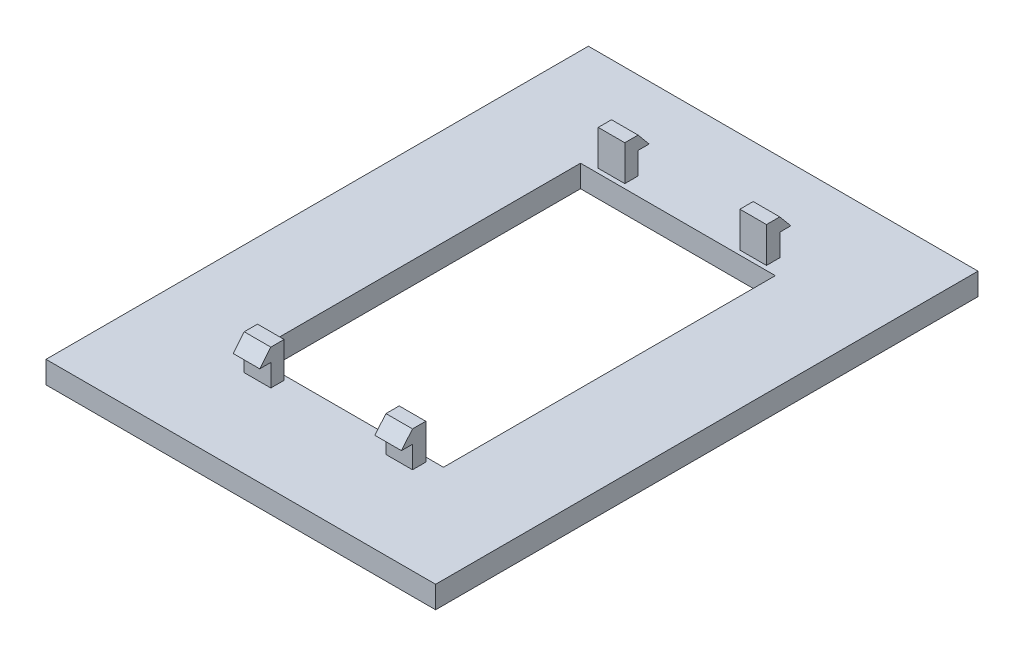
ISO-10303-21;
HEADER;
FILE_DESCRIPTION(('STEP AP214'),'2;1');
FILE_NAME('part.step','',(''),(''),'','','');
FILE_SCHEMA(('AUTOMOTIVE_DESIGN { 1 0 10303 214 1 1 1 1 }'));
ENDSEC;
DATA;
#1=APPLICATION_CONTEXT('core data for automotive mechanical design processes');
#2=APPLICATION_PROTOCOL_DEFINITION('international standard','automotive_design',2000,#1);
#3=PRODUCT_CONTEXT('',#1,'mechanical');
#4=PRODUCT('Part','Part','',(#3));
#5=PRODUCT_RELATED_PRODUCT_CATEGORY('part','',(#4));
#6=PRODUCT_DEFINITION_FORMATION('','',#4);
#7=PRODUCT_DEFINITION_CONTEXT('part definition',#1,'design');
#8=PRODUCT_DEFINITION('design','',#6,#7);
#9=PRODUCT_DEFINITION_SHAPE('','',#8);
#10=(LENGTH_UNIT() NAMED_UNIT(*) SI_UNIT(.MILLI.,.METRE.));
#11=(NAMED_UNIT(*) PLANE_ANGLE_UNIT() SI_UNIT($,.RADIAN.));
#12=(NAMED_UNIT(*) SI_UNIT($,.STERADIAN.) SOLID_ANGLE_UNIT());
#13=UNCERTAINTY_MEASURE_WITH_UNIT(LENGTH_MEASURE(1.E-05),#10,'distance_accuracy_value','');
#14=(GEOMETRIC_REPRESENTATION_CONTEXT(3) GLOBAL_UNCERTAINTY_ASSIGNED_CONTEXT((#13)) GLOBAL_UNIT_ASSIGNED_CONTEXT((#10,
#11,#12)) REPRESENTATION_CONTEXT('',''));
#15=CARTESIAN_POINT('',(0.,0.,0.));
#16=DIRECTION('',(0.,0.,1.));
#17=DIRECTION('',(1.,0.,0.));
#18=AXIS2_PLACEMENT_3D('',#15,#16,#17);
#19=CARTESIAN_POINT('',(19.,10.,0.));
#20=DIRECTION('',(0.,1.,0.));
#21=DIRECTION('',(0.,0.,1.));
#22=AXIS2_PLACEMENT_3D('',#19,#20,#21);
#23=PLANE('',#22);
#24=DIRECTION('',(0.,0.,-1.));
#25=VECTOR('',#24,1.);
#26=CARTESIAN_POINT('',(-13.,10.,0.));
#27=LINE('',#26,#25);
#28=CARTESIAN_POINT('',(-13.,10.,-41.475));
#29=VERTEX_POINT('',#28);
#30=CARTESIAN_POINT('',(-13.,10.,-43.975));
#31=VERTEX_POINT('',#30);
#32=EDGE_CURVE('E49',#29,#31,#27,.T.);
#33=ORIENTED_EDGE('',*,*,#32,.F.);
#34=DIRECTION('',(-1.,0.,0.));
#35=VECTOR('',#34,1.);
#36=CARTESIAN_POINT('',(19.,10.,-41.475));
#37=LINE('',#36,#35);
#38=CARTESIAN_POINT('',(-19.,10.,-41.475));
#39=VERTEX_POINT('',#38);
#40=EDGE_CURVE('E265',#29,#39,#37,.T.);
#41=ORIENTED_EDGE('',*,*,#40,.T.);
#42=DIRECTION('',(0.,0.,-1.));
#43=VECTOR('',#42,1.);
#44=CARTESIAN_POINT('',(-19.,10.,0.));
#45=LINE('',#44,#43);
#46=CARTESIAN_POINT('',(-19.,10.,-43.975));
#47=VERTEX_POINT('',#46);
#48=EDGE_CURVE('E481',#39,#47,#45,.T.);
#49=ORIENTED_EDGE('',*,*,#48,.T.);
#50=DIRECTION('',(-1.,0.,0.));
#51=VECTOR('',#50,1.);
#52=CARTESIAN_POINT('',(19.,10.,-43.975));
#53=LINE('',#52,#51);
#54=EDGE_CURVE('E266',#31,#47,#53,.T.);
#55=ORIENTED_EDGE('',*,*,#54,.F.);
#56=EDGE_LOOP('',(#33,#41,#49,#55));
#57=FACE_BOUND('',#56,.T.);
#58=ADVANCED_FACE('F34',(#57),#23,.F.);
#59=DIRECTION('',(0.,0.,1.));
#60=VECTOR('',#59,1.);
#61=CARTESIAN_POINT('',(13.,10.,0.));
#62=LINE('',#61,#60);
#63=CARTESIAN_POINT('',(13.,10.,-43.975));
#64=VERTEX_POINT('',#63);
#65=CARTESIAN_POINT('',(13.,10.,-41.475));
#66=VERTEX_POINT('',#65);
#67=EDGE_CURVE('E244',#64,#66,#62,.T.);
#68=ORIENTED_EDGE('',*,*,#67,.F.);
#69=CARTESIAN_POINT('',(19.,10.,-43.975));
#70=VERTEX_POINT('',#69);
#71=EDGE_CURVE('E256',#70,#64,#53,.T.);
#72=ORIENTED_EDGE('',*,*,#71,.F.);
#73=DIRECTION('',(0.,0.,-1.));
#74=VECTOR('',#73,1.);
#75=CARTESIAN_POINT('',(19.,10.,0.));
#76=LINE('',#75,#74);
#77=CARTESIAN_POINT('',(19.,10.,-41.475));
#78=VERTEX_POINT('',#77);
#79=EDGE_CURVE('E270',#78,#70,#76,.T.);
#80=ORIENTED_EDGE('',*,*,#79,.F.);
#81=EDGE_CURVE('E259',#78,#66,#37,.T.);
#82=ORIENTED_EDGE('',*,*,#81,.T.);
#83=EDGE_LOOP('',(#68,#72,#80,#82));
#84=FACE_BOUND('',#83,.T.);
#85=ADVANCED_FACE('F255',(#84),#23,.F.);
#86=CARTESIAN_POINT('',(19.,25.7254098360656,-30.8704918032787));
#87=DIRECTION('',(0.,-0.64018439966448,0.768221279597376));
#88=DIRECTION('',(0.,-0.768221279597376,-0.64018439966448));
#89=AXIS2_PLACEMENT_3D('',#86,#87,#88);
#90=PLANE('',#89);
#91=DIRECTION('',(0.,0.768221279597376,0.64018439966448));
#92=VECTOR('',#91,1.);
#93=CARTESIAN_POINT('',(-13.,25.7254098360656,-30.8704918032787));
#94=LINE('',#93,#92);
#95=CARTESIAN_POINT('',(-13.,13.,-41.475));
#96=VERTEX_POINT('',#95);
#97=EDGE_CURVE('E497',#31,#96,#94,.T.);
#98=ORIENTED_EDGE('',*,*,#97,.F.);
#99=ORIENTED_EDGE('',*,*,#54,.T.);
#100=DIRECTION('',(0.,0.768221279597376,0.64018439966448));
#101=VECTOR('',#100,1.);
#102=CARTESIAN_POINT('',(-19.,25.7254098360656,-30.8704918032787));
#103=LINE('',#102,#101);
#104=CARTESIAN_POINT('',(-19.,13.,-41.475));
#105=VERTEX_POINT('',#104);
#106=EDGE_CURVE('E483',#47,#105,#103,.T.);
#107=ORIENTED_EDGE('',*,*,#106,.T.);
#108=DIRECTION('',(1.,0.,0.));
#109=VECTOR('',#108,1.);
#110=CARTESIAN_POINT('',(0.,13.,-41.475));
#111=LINE('',#110,#109);
#112=EDGE_CURVE('E372',#105,#96,#111,.T.);
#113=ORIENTED_EDGE('',*,*,#112,.T.);
#114=EDGE_LOOP('',(#98,#99,#107,#113));
#115=FACE_BOUND('',#114,.T.);
#116=ADVANCED_FACE('F496',(#115),#90,.F.);
#117=DIRECTION('',(0.,-0.768221279597376,-0.64018439966448));
#118=VECTOR('',#117,1.);
#119=CARTESIAN_POINT('',(13.,25.7254098360656,-30.8704918032787));
#120=LINE('',#119,#118);
#121=CARTESIAN_POINT('',(13.,13.,-41.475));
#122=VERTEX_POINT('',#121);
#123=EDGE_CURVE('E241',#122,#64,#120,.T.);
#124=ORIENTED_EDGE('',*,*,#123,.F.);
#125=DIRECTION('',(-1.,0.,0.));
#126=VECTOR('',#125,1.);
#127=CARTESIAN_POINT('',(0.,13.,-41.475));
#128=LINE('',#127,#126);
#129=CARTESIAN_POINT('',(19.,13.,-41.475));
#130=VERTEX_POINT('',#129);
#131=EDGE_CURVE('E337',#130,#122,#128,.T.);
#132=ORIENTED_EDGE('',*,*,#131,.F.);
#133=DIRECTION('',(0.,0.768221279597376,0.64018439966448));
#134=VECTOR('',#133,1.);
#135=CARTESIAN_POINT('',(19.,25.7254098360656,-30.8704918032787));
#136=LINE('',#135,#134);
#137=EDGE_CURVE('E264',#70,#130,#136,.T.);
#138=ORIENTED_EDGE('',*,*,#137,.F.);
#139=ORIENTED_EDGE('',*,*,#71,.T.);
#140=EDGE_LOOP('',(#124,#132,#138,#139));
#141=FACE_BOUND('',#140,.T.);
#142=ADVANCED_FACE('F263',(#141),#90,.F.);
#143=CARTESIAN_POINT('',(19.,10.,0.));
#144=DIRECTION('',(0.,-1.,0.));
#145=DIRECTION('',(0.,0.,-1.));
#146=AXIS2_PLACEMENT_3D('',#143,#144,#145);
#147=PLANE('',#146);
#148=DIRECTION('',(-1.,0.,0.));
#149=VECTOR('',#148,1.);
#150=CARTESIAN_POINT('',(19.,10.,41.475));
#151=LINE('',#150,#149);
#152=CARTESIAN_POINT('',(-13.,10.,41.475));
#153=VERTEX_POINT('',#152);
#154=CARTESIAN_POINT('',(-19.,10.,41.475));
#155=VERTEX_POINT('',#154);
#156=EDGE_CURVE('E471',#153,#155,#151,.T.);
#157=ORIENTED_EDGE('',*,*,#156,.F.);
#158=DIRECTION('',(0.,0.,1.));
#159=VECTOR('',#158,1.);
#160=CARTESIAN_POINT('',(-13.,10.,0.));
#161=LINE('',#160,#159);
#162=CARTESIAN_POINT('',(-13.,10.,43.975));
#163=VERTEX_POINT('',#162);
#164=EDGE_CURVE('E261',#153,#163,#161,.T.);
#165=ORIENTED_EDGE('',*,*,#164,.T.);
#166=DIRECTION('',(-1.,0.,0.));
#167=VECTOR('',#166,1.);
#168=CARTESIAN_POINT('',(19.,10.,43.975));
#169=LINE('',#168,#167);
#170=CARTESIAN_POINT('',(-19.,10.,43.975));
#171=VERTEX_POINT('',#170);
#172=EDGE_CURVE('E472',#163,#171,#169,.T.);
#173=ORIENTED_EDGE('',*,*,#172,.T.);
#174=DIRECTION('',(0.,0.,1.));
#175=VECTOR('',#174,1.);
#176=CARTESIAN_POINT('',(-19.,10.,0.));
#177=LINE('',#176,#175);
#178=EDGE_CURVE('E500',#155,#171,#177,.T.);
#179=ORIENTED_EDGE('',*,*,#178,.F.);
#180=EDGE_LOOP('',(#157,#165,#173,#179));
#181=FACE_BOUND('',#180,.T.);
#182=ADVANCED_FACE('F536',(#181),#147,.T.);
#183=CARTESIAN_POINT('',(19.,10.,43.975));
#184=VERTEX_POINT('',#183);
#185=CARTESIAN_POINT('',(13.,10.,43.975));
#186=VERTEX_POINT('',#185);
#187=EDGE_CURVE('E461',#184,#186,#169,.T.);
#188=ORIENTED_EDGE('',*,*,#187,.T.);
#189=DIRECTION('',(0.,0.,-1.));
#190=VECTOR('',#189,1.);
#191=CARTESIAN_POINT('',(13.,10.,0.));
#192=LINE('',#191,#190);
#193=CARTESIAN_POINT('',(13.,10.,41.475));
#194=VERTEX_POINT('',#193);
#195=EDGE_CURVE('E57',#186,#194,#192,.T.);
#196=ORIENTED_EDGE('',*,*,#195,.T.);
#197=CARTESIAN_POINT('',(19.,10.,41.475));
#198=VERTEX_POINT('',#197);
#199=EDGE_CURVE('E475',#198,#194,#151,.T.);
#200=ORIENTED_EDGE('',*,*,#199,.F.);
#201=DIRECTION('',(0.,0.,1.));
#202=VECTOR('',#201,1.);
#203=CARTESIAN_POINT('',(19.,10.,0.));
#204=LINE('',#203,#202);
#205=EDGE_CURVE('E470',#198,#184,#204,.T.);
#206=ORIENTED_EDGE('',*,*,#205,.T.);
#207=EDGE_LOOP('',(#188,#196,#200,#206));
#208=FACE_BOUND('',#207,.T.);
#209=ADVANCED_FACE('F466',(#208),#147,.T.);
#210=CARTESIAN_POINT('',(19.,25.7254098360656,30.8704918032787));
#211=DIRECTION('',(0.,0.64018439966448,0.768221279597376));
#212=DIRECTION('',(0.,-0.768221279597376,0.64018439966448));
#213=AXIS2_PLACEMENT_3D('',#210,#211,#212);
#214=PLANE('',#213);
#215=ORIENTED_EDGE('',*,*,#172,.F.);
#216=DIRECTION('',(0.,0.768221279597376,-0.64018439966448));
#217=VECTOR('',#216,1.);
#218=CARTESIAN_POINT('',(-13.,25.7254098360656,30.8704918032787));
#219=LINE('',#218,#217);
#220=CARTESIAN_POINT('',(-13.,13.,41.475));
#221=VERTEX_POINT('',#220);
#222=EDGE_CURVE('E11',#163,#221,#219,.T.);
#223=ORIENTED_EDGE('',*,*,#222,.T.);
#224=DIRECTION('',(1.,0.,0.));
#225=VECTOR('',#224,1.);
#226=CARTESIAN_POINT('',(1.91860416443035E-13,13.,41.4749999999999));
#227=LINE('',#226,#225);
#228=CARTESIAN_POINT('',(-19.,13.,41.475));
#229=VERTEX_POINT('',#228);
#230=EDGE_CURVE('E313',#229,#221,#227,.T.);
#231=ORIENTED_EDGE('',*,*,#230,.F.);
#232=DIRECTION('',(0.,0.768221279597376,-0.64018439966448));
#233=VECTOR('',#232,1.);
#234=CARTESIAN_POINT('',(-19.,25.7254098360656,30.8704918032787));
#235=LINE('',#234,#233);
#236=EDGE_CURVE('E506',#171,#229,#235,.T.);
#237=ORIENTED_EDGE('',*,*,#236,.F.);
#238=EDGE_LOOP('',(#215,#223,#231,#237));
#239=FACE_BOUND('',#238,.T.);
#240=ADVANCED_FACE('F537',(#239),#214,.T.);
#241=DIRECTION('',(-1.,0.,0.));
#242=VECTOR('',#241,1.);
#243=CARTESIAN_POINT('',(0.,13.,41.475));
#244=LINE('',#243,#242);
#245=CARTESIAN_POINT('',(19.,13.,41.475));
#246=VERTEX_POINT('',#245);
#247=CARTESIAN_POINT('',(13.,13.,41.475));
#248=VERTEX_POINT('',#247);
#249=EDGE_CURVE('E280',#246,#248,#244,.T.);
#250=ORIENTED_EDGE('',*,*,#249,.T.);
#251=DIRECTION('',(0.,-0.768221279597376,0.64018439966448));
#252=VECTOR('',#251,1.);
#253=CARTESIAN_POINT('',(13.,25.7254098360656,30.8704918032787));
#254=LINE('',#253,#252);
#255=EDGE_CURVE('E42',#248,#186,#254,.T.);
#256=ORIENTED_EDGE('',*,*,#255,.T.);
#257=ORIENTED_EDGE('',*,*,#187,.F.);
#258=DIRECTION('',(0.,0.768221279597376,-0.64018439966448));
#259=VECTOR('',#258,1.);
#260=CARTESIAN_POINT('',(19.,25.7254098360656,30.8704918032787));
#261=LINE('',#260,#259);
#262=EDGE_CURVE('E477',#184,#246,#261,.T.);
#263=ORIENTED_EDGE('',*,*,#262,.T.);
#264=EDGE_LOOP('',(#250,#256,#257,#263));
#265=FACE_BOUND('',#264,.T.);
#266=ADVANCED_FACE('F459',(#265),#214,.T.);
#267=CARTESIAN_POINT('',(0.,13.,-41.475));
#268=DIRECTION('',(0.,0.,-1.));
#269=DIRECTION('',(-1.,0.,0.));
#270=AXIS2_PLACEMENT_3D('',#267,#268,#269);
#271=PLANE('',#270);
#272=DIRECTION('',(0.,-1.,0.));
#273=VECTOR('',#272,1.);
#274=CARTESIAN_POINT('',(-19.,13.,-41.475));
#275=LINE('',#274,#273);
#276=CARTESIAN_POINT('',(-19.,5.,-41.475));
#277=VERTEX_POINT('',#276);
#278=EDGE_CURVE('E389',#39,#277,#275,.T.);
#279=ORIENTED_EDGE('',*,*,#278,.F.);
#280=ORIENTED_EDGE('',*,*,#40,.F.);
#281=DIRECTION('',(0.,-1.,0.));
#282=VECTOR('',#281,1.);
#283=CARTESIAN_POINT('',(-13.,13.,-41.475));
#284=LINE('',#283,#282);
#285=CARTESIAN_POINT('',(-13.,5.,-41.475));
#286=VERTEX_POINT('',#285);
#287=EDGE_CURVE('E391',#29,#286,#284,.T.);
#288=ORIENTED_EDGE('',*,*,#287,.T.);
#289=DIRECTION('',(1.,0.,0.));
#290=VECTOR('',#289,1.);
#291=CARTESIAN_POINT('',(0.,5.,-41.475));
#292=LINE('',#291,#290);
#293=EDGE_CURVE('E382',#277,#286,#292,.T.);
#294=ORIENTED_EDGE('',*,*,#293,.F.);
#295=EDGE_LOOP('',(#279,#280,#288,#294));
#296=FACE_BOUND('',#295,.T.);
#297=ADVANCED_FACE('F639',(#296),#271,.T.);
#298=CARTESIAN_POINT('',(0.,13.,-41.475));
#299=DIRECTION('',(0.,0.,1.));
#300=DIRECTION('',(1.,0.,0.));
#301=AXIS2_PLACEMENT_3D('',#298,#299,#300);
#302=PLANE('',#301);
#303=ORIENTED_EDGE('',*,*,#81,.F.);
#304=DIRECTION('',(0.,-1.,0.));
#305=VECTOR('',#304,1.);
#306=CARTESIAN_POINT('',(19.,13.,-41.475));
#307=LINE('',#306,#305);
#308=CARTESIAN_POINT('',(19.,5.,-41.475));
#309=VERTEX_POINT('',#308);
#310=EDGE_CURVE('E346',#78,#309,#307,.T.);
#311=ORIENTED_EDGE('',*,*,#310,.T.);
#312=DIRECTION('',(-1.,0.,0.));
#313=VECTOR('',#312,1.);
#314=CARTESIAN_POINT('',(0.,5.,-41.475));
#315=LINE('',#314,#313);
#316=CARTESIAN_POINT('',(13.,5.,-41.475));
#317=VERTEX_POINT('',#316);
#318=EDGE_CURVE('E336',#309,#317,#315,.T.);
#319=ORIENTED_EDGE('',*,*,#318,.T.);
#320=DIRECTION('',(0.,-1.,0.));
#321=VECTOR('',#320,1.);
#322=CARTESIAN_POINT('',(13.,13.,-41.475));
#323=LINE('',#322,#321);
#324=EDGE_CURVE('E362',#66,#317,#323,.T.);
#325=ORIENTED_EDGE('',*,*,#324,.F.);
#326=EDGE_LOOP('',(#303,#311,#319,#325));
#327=FACE_BOUND('',#326,.T.);
#328=ADVANCED_FACE('F587',(#327),#302,.F.);
#329=CARTESIAN_POINT('',(0.,5.,0.));
#330=DIRECTION('',(0.,1.,0.));
#331=DIRECTION('',(0.,0.,1.));
#332=AXIS2_PLACEMENT_3D('',#329,#330,#331);
#333=PLANE('',#332);
#334=DIRECTION('',(0.,0.,-1.));
#335=VECTOR('',#334,1.);
#336=CARTESIAN_POINT('',(-13.,5.,0.));
#337=LINE('',#336,#335);
#338=CARTESIAN_POINT('',(-13.,5.,41.475));
#339=VERTEX_POINT('',#338);
#340=CARTESIAN_POINT('',(-13.,5.,38.475));
#341=VERTEX_POINT('',#340);
#342=EDGE_CURVE('E310',#339,#341,#337,.T.);
#343=ORIENTED_EDGE('',*,*,#342,.F.);
#344=DIRECTION('',(1.,0.,0.));
#345=VECTOR('',#344,1.);
#346=CARTESIAN_POINT('',(1.91860416443035E-13,5.,41.4749999999999));
#347=LINE('',#346,#345);
#348=CARTESIAN_POINT('',(-19.,5.,41.475));
#349=VERTEX_POINT('',#348);
#350=EDGE_CURVE('E324',#349,#339,#347,.T.);
#351=ORIENTED_EDGE('',*,*,#350,.F.);
#352=DIRECTION('',(0.,0.,1.));
#353=VECTOR('',#352,1.);
#354=CARTESIAN_POINT('',(-19.,5.,0.));
#355=LINE('',#354,#353);
#356=CARTESIAN_POINT('',(-19.,5.,38.475));
#357=VERTEX_POINT('',#356);
#358=EDGE_CURVE('E321',#357,#349,#355,.T.);
#359=ORIENTED_EDGE('',*,*,#358,.F.);
#360=DIRECTION('',(-1.,0.,0.));
#361=VECTOR('',#360,1.);
#362=CARTESIAN_POINT('',(0.,5.,38.475));
#363=LINE('',#362,#361);
#364=EDGE_CURVE('E305',#341,#357,#363,.T.);
#365=ORIENTED_EDGE('',*,*,#364,.F.);
#366=EDGE_LOOP('',(#343,#351,#359,#365));
#367=FACE_BOUND('',#366,.T.);
#368=DIRECTION('',(0.,0.,-1.));
#369=VECTOR('',#368,1.);
#370=CARTESIAN_POINT('',(22.,5.,-37.475));
#371=LINE('',#370,#369);
#372=CARTESIAN_POINT('',(22.,5.,37.475));
#373=VERTEX_POINT('',#372);
#374=CARTESIAN_POINT('',(22.,5.,-37.475));
#375=VERTEX_POINT('',#374);
#376=EDGE_CURVE('E396',#373,#375,#371,.T.);
#377=ORIENTED_EDGE('',*,*,#376,.F.);
#378=DIRECTION('',(1.,0.,0.));
#379=VECTOR('',#378,1.);
#380=CARTESIAN_POINT('',(-22.,5.,37.475));
#381=LINE('',#380,#379);
#382=CARTESIAN_POINT('',(-22.,5.,37.475));
#383=VERTEX_POINT('',#382);
#384=EDGE_CURVE('E401',#383,#373,#381,.T.);
#385=ORIENTED_EDGE('',*,*,#384,.F.);
#386=DIRECTION('',(0.,0.,1.));
#387=VECTOR('',#386,1.);
#388=CARTESIAN_POINT('',(-22.,5.,-37.475));
#389=LINE('',#388,#387);
#390=CARTESIAN_POINT('',(-22.,5.,-37.475));
#391=VERTEX_POINT('',#390);
#392=EDGE_CURVE('E414',#391,#383,#389,.T.);
#393=ORIENTED_EDGE('',*,*,#392,.F.);
#394=DIRECTION('',(-1.,0.,0.));
#395=VECTOR('',#394,1.);
#396=CARTESIAN_POINT('',(-22.,5.,-37.475));
#397=LINE('',#396,#395);
#398=EDGE_CURVE('E412',#375,#391,#397,.T.);
#399=ORIENTED_EDGE('',*,*,#398,.F.);
#400=EDGE_LOOP('',(#377,#385,#393,#399));
#401=FACE_BOUND('',#400,.T.);
#402=DIRECTION('',(0.,0.,1.));
#403=VECTOR('',#402,1.);
#404=CARTESIAN_POINT('',(-13.,5.,0.));
#405=LINE('',#404,#403);
#406=CARTESIAN_POINT('',(-13.,5.,-38.475));
#407=VERTEX_POINT('',#406);
#408=EDGE_CURVE('E380',#286,#407,#405,.T.);
#409=ORIENTED_EDGE('',*,*,#408,.T.);
#410=DIRECTION('',(-1.,0.,0.));
#411=VECTOR('',#410,1.);
#412=CARTESIAN_POINT('',(0.,5.,-38.475));
#413=LINE('',#412,#411);
#414=CARTESIAN_POINT('',(-19.,5.,-38.475));
#415=VERTEX_POINT('',#414);
#416=EDGE_CURVE('E364',#407,#415,#413,.T.);
#417=ORIENTED_EDGE('',*,*,#416,.T.);
#418=DIRECTION('',(0.,0.,-1.));
#419=VECTOR('',#418,1.);
#420=CARTESIAN_POINT('',(-19.,5.,0.));
#421=LINE('',#420,#419);
#422=EDGE_CURVE('E369',#415,#277,#421,.T.);
#423=ORIENTED_EDGE('',*,*,#422,.T.);
#424=ORIENTED_EDGE('',*,*,#293,.T.);
#425=EDGE_LOOP('',(#409,#417,#423,#424));
#426=FACE_BOUND('',#425,.T.);
#427=DIRECTION('',(0.,0.,1.));
#428=VECTOR('',#427,1.);
#429=CARTESIAN_POINT('',(13.,5.,0.));
#430=LINE('',#429,#428);
#431=CARTESIAN_POINT('',(13.,5.,-38.475));
#432=VERTEX_POINT('',#431);
#433=EDGE_CURVE('E349',#317,#432,#430,.T.);
#434=ORIENTED_EDGE('',*,*,#433,.F.);
#435=ORIENTED_EDGE('',*,*,#318,.F.);
#436=DIRECTION('',(0.,0.,-1.));
#437=VECTOR('',#436,1.);
#438=CARTESIAN_POINT('',(19.,5.,0.));
#439=LINE('',#438,#437);
#440=CARTESIAN_POINT('',(19.,5.,-38.475));
#441=VERTEX_POINT('',#440);
#442=EDGE_CURVE('E339',#441,#309,#439,.T.);
#443=ORIENTED_EDGE('',*,*,#442,.F.);
#444=DIRECTION('',(1.,0.,0.));
#445=VECTOR('',#444,1.);
#446=CARTESIAN_POINT('',(0.,5.,-38.475));
#447=LINE('',#446,#445);
#448=EDGE_CURVE('E351',#432,#441,#447,.T.);
#449=ORIENTED_EDGE('',*,*,#448,.F.);
#450=EDGE_LOOP('',(#434,#435,#443,#449));
#451=FACE_BOUND('',#450,.T.);
#452=DIRECTION('',(0.,0.,-1.));
#453=VECTOR('',#452,1.);
#454=CARTESIAN_POINT('',(13.,5.,0.));
#455=LINE('',#454,#453);
#456=CARTESIAN_POINT('',(13.,5.,41.475));
#457=VERTEX_POINT('',#456);
#458=CARTESIAN_POINT('',(13.,5.,38.475));
#459=VERTEX_POINT('',#458);
#460=EDGE_CURVE('E289',#457,#459,#455,.T.);
#461=ORIENTED_EDGE('',*,*,#460,.T.);
#462=DIRECTION('',(1.,0.,0.));
#463=VECTOR('',#462,1.);
#464=CARTESIAN_POINT('',(0.,5.,38.475));
#465=LINE('',#464,#463);
#466=CARTESIAN_POINT('',(19.,5.,38.475));
#467=VERTEX_POINT('',#466);
#468=EDGE_CURVE('E287',#459,#467,#465,.T.);
#469=ORIENTED_EDGE('',*,*,#468,.T.);
#470=DIRECTION('',(0.,0.,1.));
#471=VECTOR('',#470,1.);
#472=CARTESIAN_POINT('',(19.,5.,0.));
#473=LINE('',#472,#471);
#474=CARTESIAN_POINT('',(19.,5.,41.475));
#475=VERTEX_POINT('',#474);
#476=EDGE_CURVE('E277',#467,#475,#473,.T.);
#477=ORIENTED_EDGE('',*,*,#476,.T.);
#478=DIRECTION('',(-1.,0.,0.));
#479=VECTOR('',#478,1.);
#480=CARTESIAN_POINT('',(0.,5.,41.475));
#481=LINE('',#480,#479);
#482=EDGE_CURVE('E291',#475,#457,#481,.T.);
#483=ORIENTED_EDGE('',*,*,#482,.T.);
#484=EDGE_LOOP('',(#461,#469,#477,#483));
#485=FACE_BOUND('',#484,.T.);
#486=DIRECTION('',(0.,0.,-1.));
#487=VECTOR('',#486,1.);
#488=CARTESIAN_POINT('',(44.,5.,-61.25));
#489=LINE('',#488,#487);
#490=CARTESIAN_POINT('',(44.,5.,61.25));
#491=VERTEX_POINT('',#490);
#492=CARTESIAN_POINT('',(44.,5.,-61.25));
#493=VERTEX_POINT('',#492);
#494=EDGE_CURVE('E429',#491,#493,#489,.T.);
#495=ORIENTED_EDGE('',*,*,#494,.T.);
#496=DIRECTION('',(-1.,0.,0.));
#497=VECTOR('',#496,1.);
#498=CARTESIAN_POINT('',(-44.,5.,-61.25));
#499=LINE('',#498,#497);
#500=CARTESIAN_POINT('',(-44.,5.,-61.25));
#501=VERTEX_POINT('',#500);
#502=EDGE_CURVE('E432',#493,#501,#499,.T.);
#503=ORIENTED_EDGE('',*,*,#502,.T.);
#504=DIRECTION('',(0.,0.,1.));
#505=VECTOR('',#504,1.);
#506=CARTESIAN_POINT('',(-44.,5.,-61.25));
#507=LINE('',#506,#505);
#508=CARTESIAN_POINT('',(-44.,5.,61.25));
#509=VERTEX_POINT('',#508);
#510=EDGE_CURVE('E435',#501,#509,#507,.T.);
#511=ORIENTED_EDGE('',*,*,#510,.T.);
#512=DIRECTION('',(1.,0.,0.));
#513=VECTOR('',#512,1.);
#514=CARTESIAN_POINT('',(-44.,5.,61.25));
#515=LINE('',#514,#513);
#516=EDGE_CURVE('E437',#509,#491,#515,.T.);
#517=ORIENTED_EDGE('',*,*,#516,.T.);
#518=EDGE_LOOP('',(#495,#503,#511,#517));
#519=FACE_BOUND('',#518,.T.);
#520=ADVANCED_FACE('F529',(#367,#401,#426,#451,#485,#519),#333,.T.);
#521=CARTESIAN_POINT('',(44.,5.,-61.25));
#522=DIRECTION('',(-1.,0.,0.));
#523=DIRECTION('',(0.,0.,1.));
#524=AXIS2_PLACEMENT_3D('',#521,#522,#523);
#525=PLANE('',#524);
#526=DIRECTION('',(0.,0.,-1.));
#527=VECTOR('',#526,1.);
#528=CARTESIAN_POINT('',(44.,0.,-61.25));
#529=LINE('',#528,#527);
#530=CARTESIAN_POINT('',(44.,0.,61.25));
#531=VERTEX_POINT('',#530);
#532=CARTESIAN_POINT('',(44.,0.,-61.25));
#533=VERTEX_POINT('',#532);
#534=EDGE_CURVE('E421',#531,#533,#529,.T.);
#535=ORIENTED_EDGE('',*,*,#534,.T.);
#536=DIRECTION('',(0.,-1.,0.));
#537=VECTOR('',#536,1.);
#538=CARTESIAN_POINT('',(44.,5.,-61.25));
#539=LINE('',#538,#537);
#540=EDGE_CURVE('E455',#493,#533,#539,.T.);
#541=ORIENTED_EDGE('',*,*,#540,.F.);
#542=ORIENTED_EDGE('',*,*,#494,.F.);
#543=DIRECTION('',(0.,-1.,0.));
#544=VECTOR('',#543,1.);
#545=CARTESIAN_POINT('',(44.,5.,61.25));
#546=LINE('',#545,#544);
#547=EDGE_CURVE('E439',#491,#531,#546,.T.);
#548=ORIENTED_EDGE('',*,*,#547,.T.);
#549=EDGE_LOOP('',(#535,#541,#542,#548));
#550=FACE_BOUND('',#549,.T.);
#551=ADVANCED_FACE('F36',(#550),#525,.F.);
#552=CARTESIAN_POINT('',(-44.,5.,-61.25));
#553=DIRECTION('',(0.,0.,1.));
#554=DIRECTION('',(1.,0.,0.));
#555=AXIS2_PLACEMENT_3D('',#552,#553,#554);
#556=PLANE('',#555);
#557=DIRECTION('',(-1.,0.,0.));
#558=VECTOR('',#557,1.);
#559=CARTESIAN_POINT('',(-44.,0.,-61.25));
#560=LINE('',#559,#558);
#561=CARTESIAN_POINT('',(-44.,0.,-61.25));
#562=VERTEX_POINT('',#561);
#563=EDGE_CURVE('E442',#533,#562,#560,.T.);
#564=ORIENTED_EDGE('',*,*,#563,.T.);
#565=DIRECTION('',(0.,-1.,0.));
#566=VECTOR('',#565,1.);
#567=CARTESIAN_POINT('',(-44.,5.,-61.25));
#568=LINE('',#567,#566);
#569=EDGE_CURVE('E452',#501,#562,#568,.T.);
#570=ORIENTED_EDGE('',*,*,#569,.F.);
#571=ORIENTED_EDGE('',*,*,#502,.F.);
#572=ORIENTED_EDGE('',*,*,#540,.T.);
#573=EDGE_LOOP('',(#564,#570,#571,#572));
#574=FACE_BOUND('',#573,.T.);
#575=ADVANCED_FACE('F597',(#574),#556,.F.);
#576=CARTESIAN_POINT('',(-44.,5.,-61.25));
#577=DIRECTION('',(1.,0.,0.));
#578=DIRECTION('',(0.,0.,-1.));
#579=AXIS2_PLACEMENT_3D('',#576,#577,#578);
#580=PLANE('',#579);
#581=DIRECTION('',(0.,0.,1.));
#582=VECTOR('',#581,1.);
#583=CARTESIAN_POINT('',(-44.,0.,-61.25));
#584=LINE('',#583,#582);
#585=CARTESIAN_POINT('',(-44.,0.,61.25));
#586=VERTEX_POINT('',#585);
#587=EDGE_CURVE('E444',#562,#586,#584,.T.);
#588=ORIENTED_EDGE('',*,*,#587,.T.);
#589=DIRECTION('',(0.,-1.,0.));
#590=VECTOR('',#589,1.);
#591=CARTESIAN_POINT('',(-44.,5.,61.25));
#592=LINE('',#591,#590);
#593=EDGE_CURVE('E449',#509,#586,#592,.T.);
#594=ORIENTED_EDGE('',*,*,#593,.F.);
#595=ORIENTED_EDGE('',*,*,#510,.F.);
#596=ORIENTED_EDGE('',*,*,#569,.T.);
#597=EDGE_LOOP('',(#588,#594,#595,#596));
#598=FACE_BOUND('',#597,.T.);
#599=ADVANCED_FACE('F602',(#598),#580,.F.);
#600=CARTESIAN_POINT('',(-44.,5.,61.25));
#601=DIRECTION('',(0.,0.,-1.));
#602=DIRECTION('',(-1.,0.,0.));
#603=AXIS2_PLACEMENT_3D('',#600,#601,#602);
#604=PLANE('',#603);
#605=DIRECTION('',(1.,0.,0.));
#606=VECTOR('',#605,1.);
#607=CARTESIAN_POINT('',(-44.,0.,61.25));
#608=LINE('',#607,#606);
#609=EDGE_CURVE('E433',#586,#531,#608,.T.);
#610=ORIENTED_EDGE('',*,*,#609,.T.);
#611=ORIENTED_EDGE('',*,*,#547,.F.);
#612=ORIENTED_EDGE('',*,*,#516,.F.);
#613=ORIENTED_EDGE('',*,*,#593,.T.);
#614=EDGE_LOOP('',(#610,#611,#612,#613));
#615=FACE_BOUND('',#614,.T.);
#616=ADVANCED_FACE('F605',(#615),#604,.F.);
#617=CARTESIAN_POINT('',(0.,0.,0.));
#618=DIRECTION('',(0.,1.,0.));
#619=DIRECTION('',(0.,0.,1.));
#620=AXIS2_PLACEMENT_3D('',#617,#618,#619);
#621=PLANE('',#620);
#622=DIRECTION('',(1.,0.,0.));
#623=VECTOR('',#622,1.);
#624=CARTESIAN_POINT('',(-22.,0.,37.475));
#625=LINE('',#624,#623);
#626=CARTESIAN_POINT('',(-22.,0.,37.475));
#627=VERTEX_POINT('',#626);
#628=CARTESIAN_POINT('',(22.,0.,37.475));
#629=VERTEX_POINT('',#628);
#630=EDGE_CURVE('E407',#627,#629,#625,.T.);
#631=ORIENTED_EDGE('',*,*,#630,.T.);
#632=DIRECTION('',(0.,0.,-1.));
#633=VECTOR('',#632,1.);
#634=CARTESIAN_POINT('',(22.,0.,-37.475));
#635=LINE('',#634,#633);
#636=CARTESIAN_POINT('',(22.,0.,-37.475));
#637=VERTEX_POINT('',#636);
#638=EDGE_CURVE('E397',#629,#637,#635,.T.);
#639=ORIENTED_EDGE('',*,*,#638,.T.);
#640=DIRECTION('',(-1.,0.,0.));
#641=VECTOR('',#640,1.);
#642=CARTESIAN_POINT('',(-22.,0.,-37.475));
#643=LINE('',#642,#641);
#644=CARTESIAN_POINT('',(-22.,0.,-37.475));
#645=VERTEX_POINT('',#644);
#646=EDGE_CURVE('E400',#637,#645,#643,.T.);
#647=ORIENTED_EDGE('',*,*,#646,.T.);
#648=DIRECTION('',(0.,0.,1.));
#649=VECTOR('',#648,1.);
#650=CARTESIAN_POINT('',(-22.,0.,-37.475));
#651=LINE('',#650,#649);
#652=EDGE_CURVE('E404',#645,#627,#651,.T.);
#653=ORIENTED_EDGE('',*,*,#652,.T.);
#654=EDGE_LOOP('',(#631,#639,#647,#653));
#655=FACE_BOUND('',#654,.T.);
#656=ORIENTED_EDGE('',*,*,#534,.F.);
#657=ORIENTED_EDGE('',*,*,#609,.F.);
#658=ORIENTED_EDGE('',*,*,#587,.F.);
#659=ORIENTED_EDGE('',*,*,#563,.F.);
#660=EDGE_LOOP('',(#656,#657,#658,#659));
#661=FACE_BOUND('',#660,.T.);
#662=ADVANCED_FACE('F607',(#655,#661),#621,.F.);
#663=CARTESIAN_POINT('',(22.,0.,-37.475));
#664=DIRECTION('',(1.,0.,0.));
#665=DIRECTION('',(0.,0.,-1.));
#666=AXIS2_PLACEMENT_3D('',#663,#664,#665);
#667=PLANE('',#666);
#668=ORIENTED_EDGE('',*,*,#376,.T.);
#669=DIRECTION('',(0.,1.,0.));
#670=VECTOR('',#669,1.);
#671=CARTESIAN_POINT('',(22.,0.,-37.475));
#672=LINE('',#671,#670);
#673=EDGE_CURVE('E410',#637,#375,#672,.T.);
#674=ORIENTED_EDGE('',*,*,#673,.F.);
#675=ORIENTED_EDGE('',*,*,#638,.F.);
#676=DIRECTION('',(0.,1.,0.));
#677=VECTOR('',#676,1.);
#678=CARTESIAN_POINT('',(22.,0.,37.475));
#679=LINE('',#678,#677);
#680=EDGE_CURVE('E418',#629,#373,#679,.T.);
#681=ORIENTED_EDGE('',*,*,#680,.T.);
#682=EDGE_LOOP('',(#668,#674,#675,#681));
#683=FACE_BOUND('',#682,.T.);
#684=ADVANCED_FACE('F609',(#683),#667,.F.);
#685=CARTESIAN_POINT('',(-22.,0.,37.475));
#686=DIRECTION('',(0.,0.,1.));
#687=DIRECTION('',(1.,0.,0.));
#688=AXIS2_PLACEMENT_3D('',#685,#686,#687);
#689=PLANE('',#688);
#690=ORIENTED_EDGE('',*,*,#384,.T.);
#691=ORIENTED_EDGE('',*,*,#680,.F.);
#692=ORIENTED_EDGE('',*,*,#630,.F.);
#693=DIRECTION('',(0.,1.,0.));
#694=VECTOR('',#693,1.);
#695=CARTESIAN_POINT('',(-22.,0.,37.475));
#696=LINE('',#695,#694);
#697=EDGE_CURVE('E422',#627,#383,#696,.T.);
#698=ORIENTED_EDGE('',*,*,#697,.T.);
#699=EDGE_LOOP('',(#690,#691,#692,#698));
#700=FACE_BOUND('',#699,.T.);
#701=ADVANCED_FACE('F616',(#700),#689,.F.);
#702=CARTESIAN_POINT('',(-22.,0.,-37.475));
#703=DIRECTION('',(-1.,0.,0.));
#704=DIRECTION('',(0.,0.,1.));
#705=AXIS2_PLACEMENT_3D('',#702,#703,#704);
#706=PLANE('',#705);
#707=ORIENTED_EDGE('',*,*,#392,.T.);
#708=ORIENTED_EDGE('',*,*,#697,.F.);
#709=ORIENTED_EDGE('',*,*,#652,.F.);
#710=DIRECTION('',(0.,1.,0.));
#711=VECTOR('',#710,1.);
#712=CARTESIAN_POINT('',(-22.,0.,-37.475));
#713=LINE('',#712,#711);
#714=EDGE_CURVE('E424',#645,#391,#713,.T.);
#715=ORIENTED_EDGE('',*,*,#714,.T.);
#716=EDGE_LOOP('',(#707,#708,#709,#715));
#717=FACE_BOUND('',#716,.T.);
#718=ADVANCED_FACE('F773',(#717),#706,.F.);
#719=CARTESIAN_POINT('',(-22.,0.,-37.475));
#720=DIRECTION('',(0.,0.,-1.));
#721=DIRECTION('',(-1.,0.,0.));
#722=AXIS2_PLACEMENT_3D('',#719,#720,#721);
#723=PLANE('',#722);
#724=ORIENTED_EDGE('',*,*,#398,.T.);
#725=ORIENTED_EDGE('',*,*,#714,.F.);
#726=ORIENTED_EDGE('',*,*,#646,.F.);
#727=ORIENTED_EDGE('',*,*,#673,.T.);
#728=EDGE_LOOP('',(#724,#725,#726,#727));
#729=FACE_BOUND('',#728,.T.);
#730=ADVANCED_FACE('F765',(#729),#723,.F.);
#731=CARTESIAN_POINT('',(0.,13.,-38.475));
#732=DIRECTION('',(0.,0.,1.));
#733=DIRECTION('',(1.,0.,0.));
#734=AXIS2_PLACEMENT_3D('',#731,#732,#733);
#735=PLANE('',#734);
#736=ORIENTED_EDGE('',*,*,#416,.F.);
#737=DIRECTION('',(0.,-1.,0.));
#738=VECTOR('',#737,1.);
#739=CARTESIAN_POINT('',(-13.,13.,-38.475));
#740=LINE('',#739,#738);
#741=CARTESIAN_POINT('',(-13.,13.,-38.475));
#742=VERTEX_POINT('',#741);
#743=EDGE_CURVE('E393',#742,#407,#740,.T.);
#744=ORIENTED_EDGE('',*,*,#743,.F.);
#745=DIRECTION('',(-1.,0.,0.));
#746=VECTOR('',#745,1.);
#747=CARTESIAN_POINT('',(0.,13.,-38.475));
#748=LINE('',#747,#746);
#749=CARTESIAN_POINT('',(-19.,13.,-38.475));
#750=VERTEX_POINT('',#749);
#751=EDGE_CURVE('E365',#742,#750,#748,.T.);
#752=ORIENTED_EDGE('',*,*,#751,.T.);
#753=DIRECTION('',(0.,-1.,0.));
#754=VECTOR('',#753,1.);
#755=CARTESIAN_POINT('',(-19.,13.,-38.475));
#756=LINE('',#755,#754);
#757=EDGE_CURVE('E378',#750,#415,#756,.T.);
#758=ORIENTED_EDGE('',*,*,#757,.T.);
#759=EDGE_LOOP('',(#736,#744,#752,#758));
#760=FACE_BOUND('',#759,.T.);
#761=ADVANCED_FACE('F760',(#760),#735,.T.);
#762=CARTESIAN_POINT('',(-13.,13.,0.));
#763=DIRECTION('',(1.,0.,0.));
#764=DIRECTION('',(0.,0.,-1.));
#765=AXIS2_PLACEMENT_3D('',#762,#763,#764);
#766=PLANE('',#765);
#767=ORIENTED_EDGE('',*,*,#408,.F.);
#768=ORIENTED_EDGE('',*,*,#287,.F.);
#769=ORIENTED_EDGE('',*,*,#32,.T.);
#770=ORIENTED_EDGE('',*,*,#97,.T.);
#771=DIRECTION('',(0.,0.,1.));
#772=VECTOR('',#771,1.);
#773=CARTESIAN_POINT('',(-13.,13.,0.));
#774=LINE('',#773,#772);
#775=EDGE_CURVE('E368',#96,#742,#774,.T.);
#776=ORIENTED_EDGE('',*,*,#775,.T.);
#777=ORIENTED_EDGE('',*,*,#743,.T.);
#778=EDGE_LOOP('',(#767,#768,#769,#770,#776,#777));
#779=FACE_BOUND('',#778,.T.);
#780=ADVANCED_FACE('F727',(#779),#766,.T.);
#781=CARTESIAN_POINT('',(-19.,13.,0.));
#782=DIRECTION('',(-1.,0.,0.));
#783=DIRECTION('',(0.,0.,1.));
#784=AXIS2_PLACEMENT_3D('',#781,#782,#783);
#785=PLANE('',#784);
#786=ORIENTED_EDGE('',*,*,#422,.F.);
#787=ORIENTED_EDGE('',*,*,#757,.F.);
#788=DIRECTION('',(0.,0.,-1.));
#789=VECTOR('',#788,1.);
#790=CARTESIAN_POINT('',(-19.,13.,0.));
#791=LINE('',#790,#789);
#792=EDGE_CURVE('E375',#750,#105,#791,.T.);
#793=ORIENTED_EDGE('',*,*,#792,.T.);
#794=ORIENTED_EDGE('',*,*,#106,.F.);
#795=ORIENTED_EDGE('',*,*,#48,.F.);
#796=ORIENTED_EDGE('',*,*,#278,.T.);
#797=EDGE_LOOP('',(#786,#787,#793,#794,#795,#796));
#798=FACE_BOUND('',#797,.T.);
#799=ADVANCED_FACE('F493',(#798),#785,.T.);
#800=CARTESIAN_POINT('',(0.,13.,0.));
#801=DIRECTION('',(0.,1.,0.));
#802=DIRECTION('',(0.,0.,1.));
#803=AXIS2_PLACEMENT_3D('',#800,#801,#802);
#804=PLANE('',#803);
#805=ORIENTED_EDGE('',*,*,#751,.F.);
#806=ORIENTED_EDGE('',*,*,#775,.F.);
#807=ORIENTED_EDGE('',*,*,#112,.F.);
#808=ORIENTED_EDGE('',*,*,#792,.F.);
#809=EDGE_LOOP('',(#805,#806,#807,#808));
#810=FACE_BOUND('',#809,.T.);
#811=ADVANCED_FACE('F726',(#810),#804,.T.);
#812=CARTESIAN_POINT('',(13.,13.,0.));
#813=DIRECTION('',(1.,0.,0.));
#814=DIRECTION('',(0.,0.,-1.));
#815=AXIS2_PLACEMENT_3D('',#812,#813,#814);
#816=PLANE('',#815);
#817=ORIENTED_EDGE('',*,*,#433,.T.);
#818=DIRECTION('',(0.,-1.,0.));
#819=VECTOR('',#818,1.);
#820=CARTESIAN_POINT('',(13.,13.,-38.475));
#821=LINE('',#820,#819);
#822=CARTESIAN_POINT('',(13.,13.,-38.475));
#823=VERTEX_POINT('',#822);
#824=EDGE_CURVE('E359',#823,#432,#821,.T.);
#825=ORIENTED_EDGE('',*,*,#824,.F.);
#826=DIRECTION('',(0.,0.,1.));
#827=VECTOR('',#826,1.);
#828=CARTESIAN_POINT('',(13.,13.,0.));
#829=LINE('',#828,#827);
#830=EDGE_CURVE('E247',#122,#823,#829,.T.);
#831=ORIENTED_EDGE('',*,*,#830,.F.);
#832=ORIENTED_EDGE('',*,*,#123,.T.);
#833=ORIENTED_EDGE('',*,*,#67,.T.);
#834=ORIENTED_EDGE('',*,*,#324,.T.);
#835=EDGE_LOOP('',(#817,#825,#831,#832,#833,#834));
#836=FACE_BOUND('',#835,.T.);
#837=ADVANCED_FACE('F243',(#836),#816,.F.);
#838=CARTESIAN_POINT('',(0.,13.,-38.475));
#839=DIRECTION('',(0.,0.,-1.));
#840=DIRECTION('',(-1.,0.,0.));
#841=AXIS2_PLACEMENT_3D('',#838,#839,#840);
#842=PLANE('',#841);
#843=ORIENTED_EDGE('',*,*,#448,.T.);
#844=DIRECTION('',(0.,-1.,0.));
#845=VECTOR('',#844,1.);
#846=CARTESIAN_POINT('',(19.,13.,-38.475));
#847=LINE('',#846,#845);
#848=CARTESIAN_POINT('',(19.,13.,-38.475));
#849=VERTEX_POINT('',#848);
#850=EDGE_CURVE('E357',#849,#441,#847,.T.);
#851=ORIENTED_EDGE('',*,*,#850,.F.);
#852=DIRECTION('',(1.,0.,0.));
#853=VECTOR('',#852,1.);
#854=CARTESIAN_POINT('',(0.,13.,-38.475));
#855=LINE('',#854,#853);
#856=EDGE_CURVE('E341',#823,#849,#855,.T.);
#857=ORIENTED_EDGE('',*,*,#856,.F.);
#858=ORIENTED_EDGE('',*,*,#824,.T.);
#859=EDGE_LOOP('',(#843,#851,#857,#858));
#860=FACE_BOUND('',#859,.T.);
#861=ADVANCED_FACE('F714',(#860),#842,.F.);
#862=CARTESIAN_POINT('',(19.,13.,0.));
#863=DIRECTION('',(-1.,0.,0.));
#864=DIRECTION('',(0.,0.,1.));
#865=AXIS2_PLACEMENT_3D('',#862,#863,#864);
#866=PLANE('',#865);
#867=ORIENTED_EDGE('',*,*,#442,.T.);
#868=ORIENTED_EDGE('',*,*,#310,.F.);
#869=ORIENTED_EDGE('',*,*,#79,.T.);
#870=ORIENTED_EDGE('',*,*,#137,.T.);
#871=DIRECTION('',(0.,0.,-1.));
#872=VECTOR('',#871,1.);
#873=CARTESIAN_POINT('',(19.,13.,0.));
#874=LINE('',#873,#872);
#875=EDGE_CURVE('E343',#849,#130,#874,.T.);
#876=ORIENTED_EDGE('',*,*,#875,.F.);
#877=ORIENTED_EDGE('',*,*,#850,.T.);
#878=EDGE_LOOP('',(#867,#868,#869,#870,#876,#877));
#879=FACE_BOUND('',#878,.T.);
#880=ADVANCED_FACE('F709',(#879),#866,.F.);
#881=CARTESIAN_POINT('',(0.,13.,0.));
#882=DIRECTION('',(0.,1.,0.));
#883=DIRECTION('',(0.,0.,1.));
#884=AXIS2_PLACEMENT_3D('',#881,#882,#883);
#885=PLANE('',#884);
#886=ORIENTED_EDGE('',*,*,#131,.T.);
#887=ORIENTED_EDGE('',*,*,#830,.T.);
#888=ORIENTED_EDGE('',*,*,#856,.T.);
#889=ORIENTED_EDGE('',*,*,#875,.T.);
#890=EDGE_LOOP('',(#886,#887,#888,#889));
#891=FACE_BOUND('',#890,.T.);
#892=ADVANCED_FACE('F713',(#891),#885,.T.);
#893=CARTESIAN_POINT('',(0.,13.,38.475));
#894=DIRECTION('',(0.,0.,1.));
#895=DIRECTION('',(1.,0.,0.));
#896=AXIS2_PLACEMENT_3D('',#893,#894,#895);
#897=PLANE('',#896);
#898=ORIENTED_EDGE('',*,*,#364,.T.);
#899=DIRECTION('',(0.,-1.,0.));
#900=VECTOR('',#899,1.);
#901=CARTESIAN_POINT('',(-19.,13.,38.475));
#902=LINE('',#901,#900);
#903=CARTESIAN_POINT('',(-19.,13.,38.475));
#904=VERTEX_POINT('',#903);
#905=EDGE_CURVE('E334',#904,#357,#902,.T.);
#906=ORIENTED_EDGE('',*,*,#905,.F.);
#907=DIRECTION('',(-1.,0.,0.));
#908=VECTOR('',#907,1.);
#909=CARTESIAN_POINT('',(0.,13.,38.475));
#910=LINE('',#909,#908);
#911=CARTESIAN_POINT('',(-13.,13.,38.475));
#912=VERTEX_POINT('',#911);
#913=EDGE_CURVE('E306',#912,#904,#910,.T.);
#914=ORIENTED_EDGE('',*,*,#913,.F.);
#915=DIRECTION('',(0.,-1.,0.));
#916=VECTOR('',#915,1.);
#917=CARTESIAN_POINT('',(-13.,13.,38.475));
#918=LINE('',#917,#916);
#919=EDGE_CURVE('E318',#912,#341,#918,.T.);
#920=ORIENTED_EDGE('',*,*,#919,.T.);
#921=EDGE_LOOP('',(#898,#906,#914,#920));
#922=FACE_BOUND('',#921,.T.);
#923=ADVANCED_FACE('F523',(#922),#897,.F.);
#924=CARTESIAN_POINT('',(-19.,13.,0.));
#925=DIRECTION('',(1.,0.,0.));
#926=DIRECTION('',(0.,0.,-1.));
#927=AXIS2_PLACEMENT_3D('',#924,#925,#926);
#928=PLANE('',#927);
#929=ORIENTED_EDGE('',*,*,#358,.T.);
#930=DIRECTION('',(0.,-1.,0.));
#931=VECTOR('',#930,1.);
#932=CARTESIAN_POINT('',(-19.,13.,41.475));
#933=LINE('',#932,#931);
#934=EDGE_CURVE('E332',#155,#349,#933,.T.);
#935=ORIENTED_EDGE('',*,*,#934,.F.);
#936=ORIENTED_EDGE('',*,*,#178,.T.);
#937=ORIENTED_EDGE('',*,*,#236,.T.);
#938=DIRECTION('',(0.,0.,1.));
#939=VECTOR('',#938,1.);
#940=CARTESIAN_POINT('',(-19.,13.,0.));
#941=LINE('',#940,#939);
#942=EDGE_CURVE('E309',#904,#229,#941,.T.);
#943=ORIENTED_EDGE('',*,*,#942,.F.);
#944=ORIENTED_EDGE('',*,*,#905,.T.);
#945=EDGE_LOOP('',(#929,#935,#936,#937,#943,#944));
#946=FACE_BOUND('',#945,.T.);
#947=ADVANCED_FACE('F512',(#946),#928,.F.);
#948=CARTESIAN_POINT('',(1.91860416443035E-13,13.,41.4749999999999));
#949=DIRECTION('',(0.,0.,-1.));
#950=DIRECTION('',(-1.,0.,0.));
#951=AXIS2_PLACEMENT_3D('',#948,#949,#950);
#952=PLANE('',#951);
#953=DIRECTION('',(0.,-1.,0.));
#954=VECTOR('',#953,1.);
#955=CARTESIAN_POINT('',(-13.,13.,41.475));
#956=LINE('',#955,#954);
#957=EDGE_CURVE('E330',#153,#339,#956,.T.);
#958=ORIENTED_EDGE('',*,*,#957,.F.);
#959=ORIENTED_EDGE('',*,*,#156,.T.);
#960=ORIENTED_EDGE('',*,*,#934,.T.);
#961=ORIENTED_EDGE('',*,*,#350,.T.);
#962=EDGE_LOOP('',(#958,#959,#960,#961));
#963=FACE_BOUND('',#962,.T.);
#964=ADVANCED_FACE('F533',(#963),#952,.F.);
#965=CARTESIAN_POINT('',(-13.,13.,0.));
#966=DIRECTION('',(-1.,0.,0.));
#967=DIRECTION('',(0.,0.,1.));
#968=AXIS2_PLACEMENT_3D('',#965,#966,#967);
#969=PLANE('',#968);
#970=ORIENTED_EDGE('',*,*,#342,.T.);
#971=ORIENTED_EDGE('',*,*,#919,.F.);
#972=DIRECTION('',(0.,0.,-1.));
#973=VECTOR('',#972,1.);
#974=CARTESIAN_POINT('',(-13.,13.,0.));
#975=LINE('',#974,#973);
#976=EDGE_CURVE('E316',#221,#912,#975,.T.);
#977=ORIENTED_EDGE('',*,*,#976,.F.);
#978=ORIENTED_EDGE('',*,*,#222,.F.);
#979=ORIENTED_EDGE('',*,*,#164,.F.);
#980=ORIENTED_EDGE('',*,*,#957,.T.);
#981=EDGE_LOOP('',(#970,#971,#977,#978,#979,#980));
#982=FACE_BOUND('',#981,.T.);
#983=ADVANCED_FACE('F539',(#982),#969,.F.);
#984=CARTESIAN_POINT('',(0.,13.,0.));
#985=DIRECTION('',(0.,1.,0.));
#986=DIRECTION('',(0.,0.,1.));
#987=AXIS2_PLACEMENT_3D('',#984,#985,#986);
#988=PLANE('',#987);
#989=ORIENTED_EDGE('',*,*,#913,.T.);
#990=ORIENTED_EDGE('',*,*,#942,.T.);
#991=ORIENTED_EDGE('',*,*,#230,.T.);
#992=ORIENTED_EDGE('',*,*,#976,.T.);
#993=EDGE_LOOP('',(#989,#990,#991,#992));
#994=FACE_BOUND('',#993,.T.);
#995=ADVANCED_FACE('F517',(#994),#988,.T.);
#996=CARTESIAN_POINT('',(0.,13.,38.475));
#997=DIRECTION('',(0.,0.,-1.));
#998=DIRECTION('',(-1.,0.,0.));
#999=AXIS2_PLACEMENT_3D('',#996,#997,#998);
#1000=PLANE('',#999);
#1001=ORIENTED_EDGE('',*,*,#468,.F.);
#1002=DIRECTION('',(0.,-1.,0.));
#1003=VECTOR('',#1002,1.);
#1004=CARTESIAN_POINT('',(13.,13.,38.475));
#1005=LINE('',#1004,#1003);
#1006=CARTESIAN_POINT('',(13.,13.,38.475));
#1007=VERTEX_POINT('',#1006);
#1008=EDGE_CURVE('E302',#1007,#459,#1005,.T.);
#1009=ORIENTED_EDGE('',*,*,#1008,.F.);
#1010=DIRECTION('',(1.,0.,0.));
#1011=VECTOR('',#1010,1.);
#1012=CARTESIAN_POINT('',(0.,13.,38.475));
#1013=LINE('',#1012,#1011);
#1014=CARTESIAN_POINT('',(19.,13.,38.475));
#1015=VERTEX_POINT('',#1014);
#1016=EDGE_CURVE('E273',#1007,#1015,#1013,.T.);
#1017=ORIENTED_EDGE('',*,*,#1016,.T.);
#1018=DIRECTION('',(0.,-1.,0.));
#1019=VECTOR('',#1018,1.);
#1020=CARTESIAN_POINT('',(19.,13.,38.475));
#1021=LINE('',#1020,#1019);
#1022=EDGE_CURVE('E286',#1015,#467,#1021,.T.);
#1023=ORIENTED_EDGE('',*,*,#1022,.T.);
#1024=EDGE_LOOP('',(#1001,#1009,#1017,#1023));
#1025=FACE_BOUND('',#1024,.T.);
#1026=ADVANCED_FACE('F546',(#1025),#1000,.T.);
#1027=CARTESIAN_POINT('',(13.,13.,0.));
#1028=DIRECTION('',(-1.,0.,0.));
#1029=DIRECTION('',(0.,0.,1.));
#1030=AXIS2_PLACEMENT_3D('',#1027,#1028,#1029);
#1031=PLANE('',#1030);
#1032=ORIENTED_EDGE('',*,*,#460,.F.);
#1033=DIRECTION('',(0.,-1.,0.));
#1034=VECTOR('',#1033,1.);
#1035=CARTESIAN_POINT('',(13.,13.,41.475));
#1036=LINE('',#1035,#1034);
#1037=EDGE_CURVE('E300',#194,#457,#1036,.T.);
#1038=ORIENTED_EDGE('',*,*,#1037,.F.);
#1039=ORIENTED_EDGE('',*,*,#195,.F.);
#1040=ORIENTED_EDGE('',*,*,#255,.F.);
#1041=DIRECTION('',(0.,0.,-1.));
#1042=VECTOR('',#1041,1.);
#1043=CARTESIAN_POINT('',(13.,13.,0.));
#1044=LINE('',#1043,#1042);
#1045=EDGE_CURVE('E276',#248,#1007,#1044,.T.);
#1046=ORIENTED_EDGE('',*,*,#1045,.T.);
#1047=ORIENTED_EDGE('',*,*,#1008,.T.);
#1048=EDGE_LOOP('',(#1032,#1038,#1039,#1040,#1046,#1047));
#1049=FACE_BOUND('',#1048,.T.);
#1050=ADVANCED_FACE('F570',(#1049),#1031,.T.);
#1051=CARTESIAN_POINT('',(0.,13.,41.475));
#1052=DIRECTION('',(0.,0.,1.));
#1053=DIRECTION('',(1.,0.,0.));
#1054=AXIS2_PLACEMENT_3D('',#1051,#1052,#1053);
#1055=PLANE('',#1054);
#1056=ORIENTED_EDGE('',*,*,#199,.T.);
#1057=ORIENTED_EDGE('',*,*,#1037,.T.);
#1058=ORIENTED_EDGE('',*,*,#482,.F.);
#1059=DIRECTION('',(0.,-1.,0.));
#1060=VECTOR('',#1059,1.);
#1061=CARTESIAN_POINT('',(19.,13.,41.475));
#1062=LINE('',#1061,#1060);
#1063=EDGE_CURVE('E298',#198,#475,#1062,.T.);
#1064=ORIENTED_EDGE('',*,*,#1063,.F.);
#1065=EDGE_LOOP('',(#1056,#1057,#1058,#1064));
#1066=FACE_BOUND('',#1065,.T.);
#1067=ADVANCED_FACE('F566',(#1066),#1055,.T.);
#1068=CARTESIAN_POINT('',(19.,13.,0.));
#1069=DIRECTION('',(1.,0.,0.));
#1070=DIRECTION('',(0.,0.,-1.));
#1071=AXIS2_PLACEMENT_3D('',#1068,#1069,#1070);
#1072=PLANE('',#1071);
#1073=ORIENTED_EDGE('',*,*,#476,.F.);
#1074=ORIENTED_EDGE('',*,*,#1022,.F.);
#1075=DIRECTION('',(0.,0.,1.));
#1076=VECTOR('',#1075,1.);
#1077=CARTESIAN_POINT('',(19.,13.,0.));
#1078=LINE('',#1077,#1076);
#1079=EDGE_CURVE('E283',#1015,#246,#1078,.T.);
#1080=ORIENTED_EDGE('',*,*,#1079,.T.);
#1081=ORIENTED_EDGE('',*,*,#262,.F.);
#1082=ORIENTED_EDGE('',*,*,#205,.F.);
#1083=ORIENTED_EDGE('',*,*,#1063,.T.);
#1084=EDGE_LOOP('',(#1073,#1074,#1080,#1081,#1082,#1083));
#1085=FACE_BOUND('',#1084,.T.);
#1086=ADVANCED_FACE('F562',(#1085),#1072,.T.);
#1087=CARTESIAN_POINT('',(0.,13.,0.));
#1088=DIRECTION('',(0.,1.,0.));
#1089=DIRECTION('',(0.,0.,1.));
#1090=AXIS2_PLACEMENT_3D('',#1087,#1088,#1089);
#1091=PLANE('',#1090);
#1092=ORIENTED_EDGE('',*,*,#1016,.F.);
#1093=ORIENTED_EDGE('',*,*,#1045,.F.);
#1094=ORIENTED_EDGE('',*,*,#249,.F.);
#1095=ORIENTED_EDGE('',*,*,#1079,.F.);
#1096=EDGE_LOOP('',(#1092,#1093,#1094,#1095));
#1097=FACE_BOUND('',#1096,.T.);
#1098=ADVANCED_FACE('F559',(#1097),#1091,.T.);
#1099=CLOSED_SHELL('',(#58,#85,#116,#142,#182,#209,#240,#266,#297,#328,#520,#551,#575,#599,#616,
#662,#684,#701,#718,#730,#761,#780,#799,#811,#837,#861,#880,#892,#923,#947,#964,#983,#995,#1026,
#1050,#1067,#1086,#1098));
#1100=MANIFOLD_SOLID_BREP('B2',#1099);
#1101=ADVANCED_BREP_SHAPE_REPRESENTATION('',(#18,#1100),#14);
#1102=SHAPE_DEFINITION_REPRESENTATION(#9,#1101);
ENDSEC;
END-ISO-10303-21;
